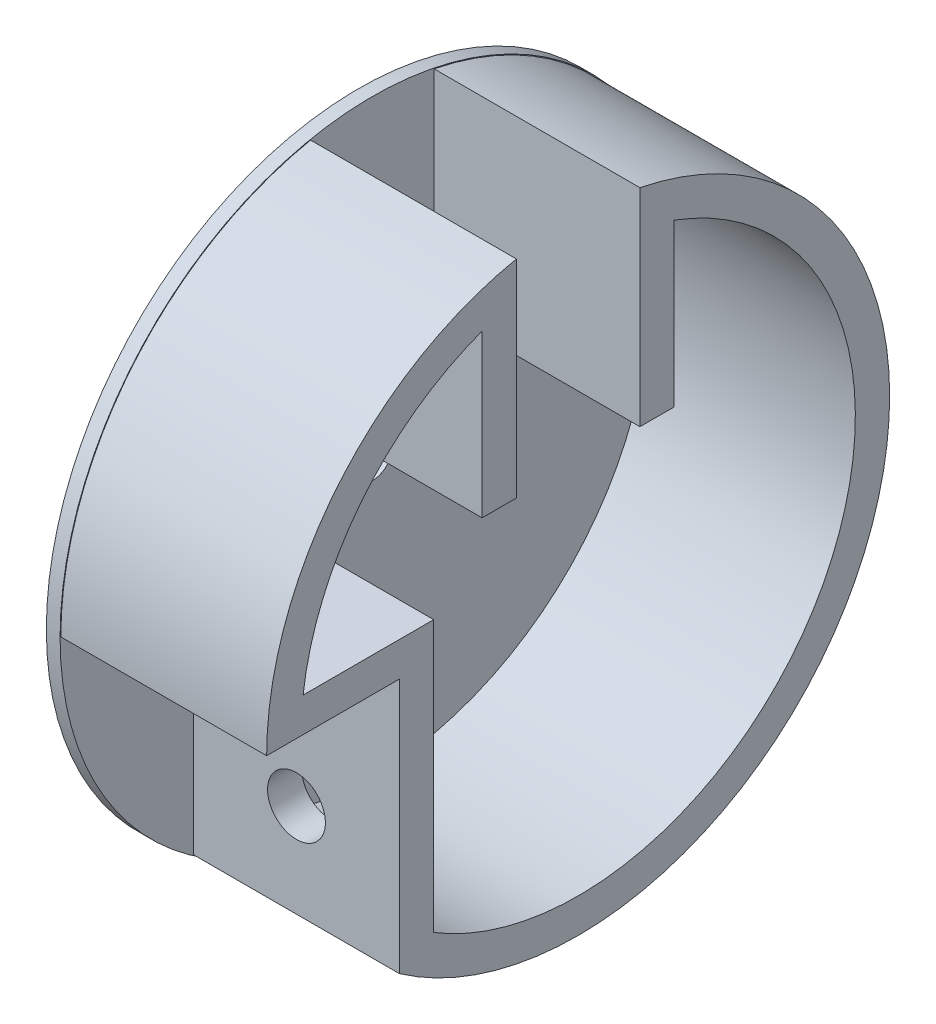
ISO-10303-21;
HEADER;
FILE_DESCRIPTION(('STEP AP214'),'2;1');
FILE_NAME('part.step','',(''),(''),'','','');
FILE_SCHEMA(('AUTOMOTIVE_DESIGN { 1 0 10303 214 1 1 1 1 }'));
ENDSEC;
DATA;
#1=APPLICATION_CONTEXT('core data for automotive mechanical design processes');
#2=APPLICATION_PROTOCOL_DEFINITION('international standard','automotive_design',2000,#1);
#3=PRODUCT_CONTEXT('',#1,'mechanical');
#4=PRODUCT('Part','Part','',(#3));
#5=PRODUCT_RELATED_PRODUCT_CATEGORY('part','',(#4));
#6=PRODUCT_DEFINITION_FORMATION('','',#4);
#7=PRODUCT_DEFINITION_CONTEXT('part definition',#1,'design');
#8=PRODUCT_DEFINITION('design','',#6,#7);
#9=PRODUCT_DEFINITION_SHAPE('','',#8);
#10=(LENGTH_UNIT() NAMED_UNIT(*) SI_UNIT(.MILLI.,.METRE.));
#11=(NAMED_UNIT(*) PLANE_ANGLE_UNIT() SI_UNIT($,.RADIAN.));
#12=(NAMED_UNIT(*) SI_UNIT($,.STERADIAN.) SOLID_ANGLE_UNIT());
#13=UNCERTAINTY_MEASURE_WITH_UNIT(LENGTH_MEASURE(1.E-05),#10,'distance_accuracy_value','');
#14=(GEOMETRIC_REPRESENTATION_CONTEXT(3) GLOBAL_UNCERTAINTY_ASSIGNED_CONTEXT((#13)) GLOBAL_UNIT_ASSIGNED_CONTEXT((#10,
#11,#12)) REPRESENTATION_CONTEXT('',''));
#15=CARTESIAN_POINT('',(0.,0.,0.));
#16=DIRECTION('',(0.,0.,1.));
#17=DIRECTION('',(1.,0.,0.));
#18=AXIS2_PLACEMENT_3D('',#15,#16,#17);
#19=CARTESIAN_POINT('',(30.,0.,0.));
#20=DIRECTION('',(1.,0.,0.));
#21=DIRECTION('',(0.,0.,-1.));
#22=AXIS2_PLACEMENT_3D('',#19,#20,#21);
#23=PLANE('',#22);
#24=DIRECTION('',(0.,-1.,0.));
#25=VECTOR('',#24,1.);
#26=CARTESIAN_POINT('',(30.,0.,-9.00000000000001));
#27=LINE('',#26,#25);
#28=CARTESIAN_POINT('',(30.,44.5006439960949,-8.99999999999999));
#29=VERTEX_POINT('',#28);
#30=CARTESIAN_POINT('',(30.,14.3257791915801,-9.));
#31=VERTEX_POINT('',#30);
#32=EDGE_CURVE('E127',#29,#31,#27,.T.);
#33=ORIENTED_EDGE('',*,*,#32,.T.);
#34=DIRECTION('',(0.,0.,-1.));
#35=VECTOR('',#34,1.);
#36=CARTESIAN_POINT('',(30.,14.3257791915801,0.));
#37=LINE('',#36,#35);
#38=CARTESIAN_POINT('',(30.,14.3257791915801,-14.));
#39=VERTEX_POINT('',#38);
#40=EDGE_CURVE('E11',#31,#39,#37,.T.);
#41=ORIENTED_EDGE('',*,*,#40,.T.);
#42=DIRECTION('',(0.,-1.,0.));
#43=VECTOR('',#42,1.);
#44=CARTESIAN_POINT('',(30.,0.,-14.));
#45=LINE('',#44,#43);
#46=CARTESIAN_POINT('',(30.,37.8984312620007,-14.));
#47=VERTEX_POINT('',#46);
#48=EDGE_CURVE('E465',#47,#39,#45,.T.);
#49=ORIENTED_EDGE('',*,*,#48,.F.);
#50=CARTESIAN_POINT('',(30.,0.,0.));
#51=DIRECTION('',(1.,0.,0.));
#52=DIRECTION('',(0.,0.,-1.));
#53=AXIS2_PLACEMENT_3D('',#50,#51,#52);
#54=CIRCLE('',#53,40.4016223946587);
#55=CARTESIAN_POINT('',(30.,-34.4821417654368,21.0540492872252));
#56=VERTEX_POINT('',#55);
#57=EDGE_CURVE('E467',#47,#56,#54,.F.);
#58=ORIENTED_EDGE('',*,*,#57,.T.);
#59=DIRECTION('',(0.,-1.,0.));
#60=VECTOR('',#59,1.);
#61=CARTESIAN_POINT('',(30.,0.,21.0540492872252));
#62=LINE('',#61,#60);
#63=CARTESIAN_POINT('',(30.,5.,21.0540492872252));
#64=VERTEX_POINT('',#63);
#65=EDGE_CURVE('E470',#64,#56,#62,.T.);
#66=ORIENTED_EDGE('',*,*,#65,.F.);
#67=DIRECTION('',(0.,0.,-1.));
#68=VECTOR('',#67,1.);
#69=CARTESIAN_POINT('',(30.,5.,0.));
#70=LINE('',#69,#68);
#71=CARTESIAN_POINT('',(30.,5.,40.0910350592322));
#72=VERTEX_POINT('',#71);
#73=EDGE_CURVE('E474',#72,#64,#70,.T.);
#74=ORIENTED_EDGE('',*,*,#73,.F.);
#75=CARTESIAN_POINT('',(30.,0.,0.));
#76=DIRECTION('',(1.,0.,0.));
#77=DIRECTION('',(0.,0.,-1.));
#78=AXIS2_PLACEMENT_3D('',#75,#76,#77);
#79=CIRCLE('',#78,40.4016223946587);
#80=CARTESIAN_POINT('',(30.,37.8984312620007,14.));
#81=VERTEX_POINT('',#80);
#82=EDGE_CURVE('E176',#72,#81,#79,.F.);
#83=ORIENTED_EDGE('',*,*,#82,.T.);
#84=DIRECTION('',(0.,-1.,0.));
#85=VECTOR('',#84,1.);
#86=CARTESIAN_POINT('',(30.,0.,14.));
#87=LINE('',#86,#85);
#88=CARTESIAN_POINT('',(30.,14.3257791915801,14.));
#89=VERTEX_POINT('',#88);
#90=EDGE_CURVE('E246',#81,#89,#87,.T.);
#91=ORIENTED_EDGE('',*,*,#90,.T.);
#92=CARTESIAN_POINT('',(30.,14.3257791915801,9.));
#93=VERTEX_POINT('',#92);
#94=EDGE_CURVE('E52',#89,#93,#37,.T.);
#95=ORIENTED_EDGE('',*,*,#94,.T.);
#96=DIRECTION('',(0.,-1.,0.));
#97=VECTOR('',#96,1.);
#98=CARTESIAN_POINT('',(30.,0.,9.));
#99=LINE('',#98,#97);
#100=CARTESIAN_POINT('',(30.,44.5006439960949,8.99999999999999));
#101=VERTEX_POINT('',#100);
#102=EDGE_CURVE('E129',#101,#93,#99,.T.);
#103=ORIENTED_EDGE('',*,*,#102,.F.);
#104=CARTESIAN_POINT('',(30.,0.,0.));
#105=DIRECTION('',(1.,0.,0.));
#106=DIRECTION('',(0.,0.,-1.));
#107=AXIS2_PLACEMENT_3D('',#104,#105,#106);
#108=CIRCLE('',#107,45.4016223946587);
#109=CARTESIAN_POINT('',(30.,0.,45.4016223946587));
#110=VERTEX_POINT('',#109);
#111=EDGE_CURVE('E149',#110,#101,#108,.F.);
#112=ORIENTED_EDGE('',*,*,#111,.F.);
#113=DIRECTION('',(0.,0.,-1.));
#114=VECTOR('',#113,1.);
#115=CARTESIAN_POINT('',(30.,0.,0.));
#116=LINE('',#115,#114);
#117=CARTESIAN_POINT('',(30.,0.,26.0540492872252));
#118=VERTEX_POINT('',#117);
#119=EDGE_CURVE('E109',#110,#118,#116,.T.);
#120=ORIENTED_EDGE('',*,*,#119,.T.);
#121=DIRECTION('',(0.,-1.,0.));
#122=VECTOR('',#121,1.);
#123=CARTESIAN_POINT('',(30.,0.,26.0540492872252));
#124=LINE('',#123,#122);
#125=CARTESIAN_POINT('',(30.,-37.1819019390619,26.0540492872252));
#126=VERTEX_POINT('',#125);
#127=EDGE_CURVE('E103',#118,#126,#124,.T.);
#128=ORIENTED_EDGE('',*,*,#127,.T.);
#129=CARTESIAN_POINT('',(30.,0.,0.));
#130=DIRECTION('',(1.,0.,0.));
#131=DIRECTION('',(0.,0.,-1.));
#132=AXIS2_PLACEMENT_3D('',#129,#130,#131);
#133=CIRCLE('',#132,45.4016223946587);
#134=EDGE_CURVE('E107',#29,#126,#133,.F.);
#135=ORIENTED_EDGE('',*,*,#134,.F.);
#136=EDGE_LOOP('',(#33,#41,#49,#58,#66,#74,#83,#91,#95,#103,#112,#120,#128,#135));
#137=FACE_BOUND('',#136,.T.);
#138=ADVANCED_FACE('F41',(#137),#23,.T.);
#139=CARTESIAN_POINT('',(30.,0.,0.));
#140=DIRECTION('',(-1.,0.,0.));
#141=DIRECTION('',(0.,0.,1.));
#142=AXIS2_PLACEMENT_3D('',#139,#140,#141);
#143=CYLINDRICAL_SURFACE('',#142,45.4016223946587);
#144=CARTESIAN_POINT('',(0.,0.,0.));
#145=DIRECTION('',(1.,0.,0.));
#146=DIRECTION('',(0.,0.,-1.));
#147=AXIS2_PLACEMENT_3D('',#144,#145,#146);
#148=CIRCLE('',#147,45.4016223946587);
#149=CARTESIAN_POINT('',(0.,0.,45.4016223946587));
#150=VERTEX_POINT('',#149);
#151=CARTESIAN_POINT('',(0.,44.5006439960949,8.99999999999999));
#152=VERTEX_POINT('',#151);
#153=EDGE_CURVE('E134',#150,#152,#148,.F.);
#154=ORIENTED_EDGE('',*,*,#153,.F.);
#155=DIRECTION('',(-1.,0.,0.));
#156=VECTOR('',#155,1.);
#157=CARTESIAN_POINT('',(30.,0.,45.4016223946587));
#158=LINE('',#157,#156);
#159=EDGE_CURVE('E45',#110,#150,#158,.T.);
#160=ORIENTED_EDGE('',*,*,#159,.F.);
#161=ORIENTED_EDGE('',*,*,#111,.T.);
#162=DIRECTION('',(-1.,0.,0.));
#163=VECTOR('',#162,1.);
#164=CARTESIAN_POINT('',(30.,44.5006439960949,8.99999999999999));
#165=LINE('',#164,#163);
#166=EDGE_CURVE('E68',#101,#152,#165,.T.);
#167=ORIENTED_EDGE('',*,*,#166,.T.);
#168=EDGE_LOOP('',(#154,#160,#161,#167));
#169=FACE_BOUND('',#168,.T.);
#170=ADVANCED_FACE('F43',(#169),#143,.T.);
#171=CARTESIAN_POINT('',(30.,0.,0.));
#172=DIRECTION('',(0.,1.,0.));
#173=DIRECTION('',(0.,0.,1.));
#174=AXIS2_PLACEMENT_3D('',#171,#172,#173);
#175=PLANE('',#174);
#176=DIRECTION('',(0.,0.,-1.));
#177=VECTOR('',#176,1.);
#178=CARTESIAN_POINT('',(0.,0.,0.));
#179=LINE('',#178,#177);
#180=CARTESIAN_POINT('',(0.,0.,26.0540492872252));
#181=VERTEX_POINT('',#180);
#182=EDGE_CURVE('E137',#150,#181,#179,.T.);
#183=ORIENTED_EDGE('',*,*,#182,.T.);
#184=DIRECTION('',(-1.,0.,0.));
#185=VECTOR('',#184,1.);
#186=CARTESIAN_POINT('',(30.,0.,26.0540492872252));
#187=LINE('',#186,#185);
#188=EDGE_CURVE('E122',#118,#181,#187,.T.);
#189=ORIENTED_EDGE('',*,*,#188,.F.);
#190=ORIENTED_EDGE('',*,*,#119,.F.);
#191=ORIENTED_EDGE('',*,*,#159,.T.);
#192=EDGE_LOOP('',(#183,#189,#190,#191));
#193=FACE_BOUND('',#192,.T.);
#194=ADVANCED_FACE('F260',(#193),#175,.F.);
#195=CARTESIAN_POINT('',(30.,0.,26.0540492872252));
#196=DIRECTION('',(0.,0.,-1.));
#197=DIRECTION('',(0.,1.,0.));
#198=AXIS2_PLACEMENT_3D('',#195,#196,#197);
#199=PLANE('',#198);
#200=CARTESIAN_POINT('',(15.,-23.5302877443781,26.0540492872252));
#201=DIRECTION('',(0.,0.,1.));
#202=DIRECTION('',(0.,-1.,0.));
#203=AXIS2_PLACEMENT_3D('',#200,#201,#202);
#204=CIRCLE('',#203,4.21639999999999);
#205=CARTESIAN_POINT('',(15.,-27.7466877443781,26.0540492872252));
#206=VERTEX_POINT('',#205);
#207=EDGE_CURVE('E448',#206,#206,#204,.T.);
#208=ORIENTED_EDGE('',*,*,#207,.F.);
#209=EDGE_LOOP('',(#208));
#210=FACE_BOUND('',#209,.T.);
#211=DIRECTION('',(0.,-1.,0.));
#212=VECTOR('',#211,1.);
#213=CARTESIAN_POINT('',(0.,0.,26.0540492872252));
#214=LINE('',#213,#212);
#215=CARTESIAN_POINT('',(0.,-37.1819019390619,26.0540492872252));
#216=VERTEX_POINT('',#215);
#217=EDGE_CURVE('E118',#181,#216,#214,.T.);
#218=ORIENTED_EDGE('',*,*,#217,.T.);
#219=DIRECTION('',(-1.,0.,0.));
#220=VECTOR('',#219,1.);
#221=CARTESIAN_POINT('',(30.,-37.1819019390619,26.0540492872252));
#222=LINE('',#221,#220);
#223=EDGE_CURVE('E115',#126,#216,#222,.T.);
#224=ORIENTED_EDGE('',*,*,#223,.F.);
#225=ORIENTED_EDGE('',*,*,#127,.F.);
#226=ORIENTED_EDGE('',*,*,#188,.T.);
#227=EDGE_LOOP('',(#218,#224,#225,#226));
#228=FACE_BOUND('',#227,.T.);
#229=ADVANCED_FACE('F116',(#210,#228),#199,.F.);
#230=CARTESIAN_POINT('',(30.,0.,0.));
#231=DIRECTION('',(-1.,0.,0.));
#232=DIRECTION('',(0.,0.,1.));
#233=AXIS2_PLACEMENT_3D('',#230,#231,#232);
#234=CYLINDRICAL_SURFACE('',#233,45.4016223946587);
#235=CARTESIAN_POINT('',(0.,0.,0.));
#236=DIRECTION('',(1.,0.,0.));
#237=DIRECTION('',(0.,0.,-1.));
#238=AXIS2_PLACEMENT_3D('',#235,#236,#237);
#239=CIRCLE('',#238,45.4016223946587);
#240=CARTESIAN_POINT('',(0.,44.5006439960949,-8.99999999999999));
#241=VERTEX_POINT('',#240);
#242=EDGE_CURVE('E141',#241,#216,#239,.F.);
#243=ORIENTED_EDGE('',*,*,#242,.F.);
#244=DIRECTION('',(-1.,0.,0.));
#245=VECTOR('',#244,1.);
#246=CARTESIAN_POINT('',(30.,44.5006439960949,-8.99999999999999));
#247=LINE('',#246,#245);
#248=EDGE_CURVE('E123',#29,#241,#247,.T.);
#249=ORIENTED_EDGE('',*,*,#248,.F.);
#250=ORIENTED_EDGE('',*,*,#134,.T.);
#251=ORIENTED_EDGE('',*,*,#223,.T.);
#252=EDGE_LOOP('',(#243,#249,#250,#251));
#253=FACE_BOUND('',#252,.T.);
#254=ADVANCED_FACE('F125',(#253),#234,.T.);
#255=CARTESIAN_POINT('',(30.,0.,-9.00000000000001));
#256=DIRECTION('',(0.,0.,-1.));
#257=DIRECTION('',(0.,1.,0.));
#258=AXIS2_PLACEMENT_3D('',#255,#256,#257);
#259=PLANE('',#258);
#260=DIRECTION('',(0.,-1.,0.));
#261=VECTOR('',#260,1.);
#262=CARTESIAN_POINT('',(0.,0.,-9.00000000000001));
#263=LINE('',#262,#261);
#264=CARTESIAN_POINT('',(0.,14.3257791915801,-9.));
#265=VERTEX_POINT('',#264);
#266=EDGE_CURVE('E143',#241,#265,#263,.T.);
#267=ORIENTED_EDGE('',*,*,#266,.T.);
#268=DIRECTION('',(-1.,0.,0.));
#269=VECTOR('',#268,1.);
#270=CARTESIAN_POINT('',(30.,14.3257791915801,-9.));
#271=LINE('',#270,#269);
#272=EDGE_CURVE('E154',#31,#265,#271,.T.);
#273=ORIENTED_EDGE('',*,*,#272,.F.);
#274=ORIENTED_EDGE('',*,*,#32,.F.);
#275=ORIENTED_EDGE('',*,*,#248,.T.);
#276=EDGE_LOOP('',(#267,#273,#274,#275));
#277=FACE_BOUND('',#276,.T.);
#278=ADVANCED_FACE('F278',(#277),#259,.F.);
#279=CARTESIAN_POINT('',(30.,0.,9.));
#280=DIRECTION('',(0.,0.,-1.));
#281=DIRECTION('',(0.,1.,0.));
#282=AXIS2_PLACEMENT_3D('',#279,#280,#281);
#283=PLANE('',#282);
#284=DIRECTION('',(0.,-1.,0.));
#285=VECTOR('',#284,1.);
#286=CARTESIAN_POINT('',(0.,0.,9.));
#287=LINE('',#286,#285);
#288=CARTESIAN_POINT('',(0.,14.3257791915801,8.99999999999999));
#289=VERTEX_POINT('',#288);
#290=EDGE_CURVE('E146',#152,#289,#287,.T.);
#291=ORIENTED_EDGE('',*,*,#290,.F.);
#292=ORIENTED_EDGE('',*,*,#166,.F.);
#293=ORIENTED_EDGE('',*,*,#102,.T.);
#294=DIRECTION('',(-1.,0.,0.));
#295=VECTOR('',#294,1.);
#296=CARTESIAN_POINT('',(30.,14.3257791915801,9.));
#297=LINE('',#296,#295);
#298=EDGE_CURVE('E151',#93,#289,#297,.T.);
#299=ORIENTED_EDGE('',*,*,#298,.T.);
#300=EDGE_LOOP('',(#291,#292,#293,#299));
#301=FACE_BOUND('',#300,.T.);
#302=ADVANCED_FACE('F200',(#301),#283,.T.);
#303=CARTESIAN_POINT('',(30.,14.3257791915801,0.));
#304=DIRECTION('',(0.,1.,0.));
#305=DIRECTION('',(0.,0.,1.));
#306=AXIS2_PLACEMENT_3D('',#303,#304,#305);
#307=PLANE('',#306);
#308=ORIENTED_EDGE('',*,*,#94,.F.);
#309=DIRECTION('',(-1.,0.,0.));
#310=VECTOR('',#309,1.);
#311=CARTESIAN_POINT('',(30.,14.3257791915801,14.));
#312=LINE('',#311,#310);
#313=CARTESIAN_POINT('',(0.,14.3257791915801,14.));
#314=VERTEX_POINT('',#313);
#315=EDGE_CURVE('E250',#89,#314,#312,.T.);
#316=ORIENTED_EDGE('',*,*,#315,.T.);
#317=DIRECTION('',(0.,0.,-1.));
#318=VECTOR('',#317,1.);
#319=CARTESIAN_POINT('',(0.,14.3257791915801,0.));
#320=LINE('',#319,#318);
#321=EDGE_CURVE('E160',#314,#289,#320,.T.);
#322=ORIENTED_EDGE('',*,*,#321,.T.);
#323=ORIENTED_EDGE('',*,*,#298,.F.);
#324=EDGE_LOOP('',(#308,#316,#322,#323));
#325=FACE_BOUND('',#324,.T.);
#326=ADVANCED_FACE('F277',(#325),#307,.F.);
#327=CARTESIAN_POINT('',(30.,0.,0.));
#328=DIRECTION('',(-1.,0.,0.));
#329=DIRECTION('',(0.,0.,1.));
#330=AXIS2_PLACEMENT_3D('',#327,#328,#329);
#331=CYLINDRICAL_SURFACE('',#330,40.4016223946587);
#332=CARTESIAN_POINT('',(0.,0.,0.));
#333=DIRECTION('',(1.,0.,0.));
#334=DIRECTION('',(0.,0.,-1.));
#335=AXIS2_PLACEMENT_3D('',#332,#333,#334);
#336=CIRCLE('',#335,40.4016223946587);
#337=CARTESIAN_POINT('',(0.,5.,40.0910350592322));
#338=VERTEX_POINT('',#337);
#339=CARTESIAN_POINT('',(0.,37.8984312620007,14.));
#340=VERTEX_POINT('',#339);
#341=EDGE_CURVE('E194',#338,#340,#336,.F.);
#342=ORIENTED_EDGE('',*,*,#341,.T.);
#343=DIRECTION('',(-1.,0.,0.));
#344=VECTOR('',#343,1.);
#345=CARTESIAN_POINT('',(30.,37.8984312620007,14.));
#346=LINE('',#345,#344);
#347=EDGE_CURVE('E242',#81,#340,#346,.T.);
#348=ORIENTED_EDGE('',*,*,#347,.F.);
#349=ORIENTED_EDGE('',*,*,#82,.F.);
#350=DIRECTION('',(-1.,0.,0.));
#351=VECTOR('',#350,1.);
#352=CARTESIAN_POINT('',(30.,5.,40.0910350592322));
#353=LINE('',#352,#351);
#354=EDGE_CURVE('E138',#72,#338,#353,.T.);
#355=ORIENTED_EDGE('',*,*,#354,.T.);
#356=EDGE_LOOP('',(#342,#348,#349,#355));
#357=FACE_BOUND('',#356,.T.);
#358=ADVANCED_FACE('F253',(#357),#331,.F.);
#359=CARTESIAN_POINT('',(30.,5.,0.));
#360=DIRECTION('',(0.,1.,0.));
#361=DIRECTION('',(0.,0.,1.));
#362=AXIS2_PLACEMENT_3D('',#359,#360,#361);
#363=PLANE('',#362);
#364=DIRECTION('',(0.,0.,-1.));
#365=VECTOR('',#364,1.);
#366=CARTESIAN_POINT('',(0.,5.,0.));
#367=LINE('',#366,#365);
#368=CARTESIAN_POINT('',(0.,5.,21.0540492872252));
#369=VERTEX_POINT('',#368);
#370=EDGE_CURVE('E191',#338,#369,#367,.T.);
#371=ORIENTED_EDGE('',*,*,#370,.F.);
#372=ORIENTED_EDGE('',*,*,#354,.F.);
#373=ORIENTED_EDGE('',*,*,#73,.T.);
#374=DIRECTION('',(-1.,0.,0.));
#375=VECTOR('',#374,1.);
#376=CARTESIAN_POINT('',(30.,5.,21.0540492872252));
#377=LINE('',#376,#375);
#378=EDGE_CURVE('E482',#64,#369,#377,.T.);
#379=ORIENTED_EDGE('',*,*,#378,.T.);
#380=EDGE_LOOP('',(#371,#372,#373,#379));
#381=FACE_BOUND('',#380,.T.);
#382=ADVANCED_FACE('F308',(#381),#363,.T.);
#383=CARTESIAN_POINT('',(30.,0.,21.0540492872252));
#384=DIRECTION('',(0.,0.,-1.));
#385=DIRECTION('',(0.,1.,0.));
#386=AXIS2_PLACEMENT_3D('',#383,#384,#385);
#387=PLANE('',#386);
#388=CARTESIAN_POINT('',(15.,-23.5302877443781,21.0540492872252));
#389=DIRECTION('',(0.,0.,-1.));
#390=DIRECTION('',(0.,1.,0.));
#391=AXIS2_PLACEMENT_3D('',#388,#389,#390);
#392=CIRCLE('',#391,4.21639999999999);
#393=CARTESIAN_POINT('',(15.,-19.3138877443781,21.0540492872252));
#394=VERTEX_POINT('',#393);
#395=EDGE_CURVE('E451',#394,#394,#392,.T.);
#396=ORIENTED_EDGE('',*,*,#395,.F.);
#397=EDGE_LOOP('',(#396));
#398=FACE_BOUND('',#397,.T.);
#399=DIRECTION('',(0.,-1.,0.));
#400=VECTOR('',#399,1.);
#401=CARTESIAN_POINT('',(0.,0.,21.0540492872252));
#402=LINE('',#401,#400);
#403=CARTESIAN_POINT('',(0.,-34.4821417654368,21.0540492872252));
#404=VERTEX_POINT('',#403);
#405=EDGE_CURVE('E59',#369,#404,#402,.T.);
#406=ORIENTED_EDGE('',*,*,#405,.F.);
#407=ORIENTED_EDGE('',*,*,#378,.F.);
#408=ORIENTED_EDGE('',*,*,#65,.T.);
#409=DIRECTION('',(-1.,0.,0.));
#410=VECTOR('',#409,1.);
#411=CARTESIAN_POINT('',(30.,-34.4821417654368,21.0540492872252));
#412=LINE('',#411,#410);
#413=EDGE_CURVE('E480',#56,#404,#412,.T.);
#414=ORIENTED_EDGE('',*,*,#413,.T.);
#415=EDGE_LOOP('',(#406,#407,#408,#414));
#416=FACE_BOUND('',#415,.T.);
#417=ADVANCED_FACE('F315',(#398,#416),#387,.T.);
#418=CARTESIAN_POINT('',(30.,0.,0.));
#419=DIRECTION('',(-1.,0.,0.));
#420=DIRECTION('',(0.,0.,1.));
#421=AXIS2_PLACEMENT_3D('',#418,#419,#420);
#422=CYLINDRICAL_SURFACE('',#421,40.4016223946587);
#423=CARTESIAN_POINT('',(0.,0.,0.));
#424=DIRECTION('',(1.,0.,0.));
#425=DIRECTION('',(0.,0.,-1.));
#426=AXIS2_PLACEMENT_3D('',#423,#424,#425);
#427=CIRCLE('',#426,40.4016223946587);
#428=CARTESIAN_POINT('',(0.,37.8984312620007,-14.));
#429=VERTEX_POINT('',#428);
#430=EDGE_CURVE('E179',#429,#404,#427,.F.);
#431=ORIENTED_EDGE('',*,*,#430,.T.);
#432=ORIENTED_EDGE('',*,*,#413,.F.);
#433=ORIENTED_EDGE('',*,*,#57,.F.);
#434=DIRECTION('',(-1.,0.,0.));
#435=VECTOR('',#434,1.);
#436=CARTESIAN_POINT('',(30.,37.8984312620007,-14.));
#437=LINE('',#436,#435);
#438=EDGE_CURVE('E478',#47,#429,#437,.T.);
#439=ORIENTED_EDGE('',*,*,#438,.T.);
#440=EDGE_LOOP('',(#431,#432,#433,#439));
#441=FACE_BOUND('',#440,.T.);
#442=ADVANCED_FACE('F324',(#441),#422,.F.);
#443=CARTESIAN_POINT('',(30.,0.,-14.));
#444=DIRECTION('',(0.,0.,-1.));
#445=DIRECTION('',(0.,1.,0.));
#446=AXIS2_PLACEMENT_3D('',#443,#444,#445);
#447=PLANE('',#446);
#448=DIRECTION('',(0.,-1.,0.));
#449=VECTOR('',#448,1.);
#450=CARTESIAN_POINT('',(0.,0.,-14.));
#451=LINE('',#450,#449);
#452=CARTESIAN_POINT('',(0.,14.3257791915801,-14.));
#453=VERTEX_POINT('',#452);
#454=EDGE_CURVE('E169',#429,#453,#451,.T.);
#455=ORIENTED_EDGE('',*,*,#454,.F.);
#456=ORIENTED_EDGE('',*,*,#438,.F.);
#457=ORIENTED_EDGE('',*,*,#48,.T.);
#458=DIRECTION('',(-1.,0.,0.));
#459=VECTOR('',#458,1.);
#460=CARTESIAN_POINT('',(30.,14.3257791915801,-14.));
#461=LINE('',#460,#459);
#462=EDGE_CURVE('E187',#39,#453,#461,.T.);
#463=ORIENTED_EDGE('',*,*,#462,.T.);
#464=EDGE_LOOP('',(#455,#456,#457,#463));
#465=FACE_BOUND('',#464,.T.);
#466=ADVANCED_FACE('F332',(#465),#447,.T.);
#467=ORIENTED_EDGE('',*,*,#272,.T.);
#468=EDGE_CURVE('E50',#265,#453,#320,.T.);
#469=ORIENTED_EDGE('',*,*,#468,.T.);
#470=ORIENTED_EDGE('',*,*,#462,.F.);
#471=ORIENTED_EDGE('',*,*,#40,.F.);
#472=EDGE_LOOP('',(#467,#469,#470,#471));
#473=FACE_BOUND('',#472,.T.);
#474=ADVANCED_FACE('F302',(#473),#307,.F.);
#475=CARTESIAN_POINT('',(30.,0.,14.));
#476=DIRECTION('',(0.,0.,-1.));
#477=DIRECTION('',(0.,1.,0.));
#478=AXIS2_PLACEMENT_3D('',#475,#476,#477);
#479=PLANE('',#478);
#480=DIRECTION('',(0.,-1.,0.));
#481=VECTOR('',#480,1.);
#482=CARTESIAN_POINT('',(0.,0.,14.));
#483=LINE('',#482,#481);
#484=EDGE_CURVE('E168',#340,#314,#483,.T.);
#485=ORIENTED_EDGE('',*,*,#484,.T.);
#486=ORIENTED_EDGE('',*,*,#315,.F.);
#487=ORIENTED_EDGE('',*,*,#90,.F.);
#488=ORIENTED_EDGE('',*,*,#347,.T.);
#489=EDGE_LOOP('',(#485,#486,#487,#488));
#490=FACE_BOUND('',#489,.T.);
#491=ADVANCED_FACE('F244',(#490),#479,.F.);
#492=CARTESIAN_POINT('',(-1.99999999999999,0.,0.));
#493=DIRECTION('',(-1.,0.,0.));
#494=DIRECTION('',(0.,0.,1.));
#495=AXIS2_PLACEMENT_3D('',#492,#493,#494);
#496=PLANE('',#495);
#497=CARTESIAN_POINT('',(-1.99999999999999,0.,0.));
#498=DIRECTION('',(-1.,0.,0.));
#499=DIRECTION('',(0.,0.,1.));
#500=AXIS2_PLACEMENT_3D('',#497,#498,#499);
#501=CIRCLE('',#500,45.5105578648431);
#502=CARTESIAN_POINT('',(-1.99999999999999,0.,45.5105578648431));
#503=VERTEX_POINT('',#502);
#504=EDGE_CURVE('E255',#503,#503,#501,.T.);
#505=ORIENTED_EDGE('',*,*,#504,.T.);
#506=EDGE_LOOP('',(#505));
#507=FACE_BOUND('',#506,.T.);
#508=CARTESIAN_POINT('',(-1.99999999999999,0.,0.));
#509=DIRECTION('',(-1.,0.,0.));
#510=DIRECTION('',(0.,0.,1.));
#511=AXIS2_PLACEMENT_3D('',#508,#509,#510);
#512=CIRCLE('',#511,3.);
#513=CARTESIAN_POINT('',(-1.99999999999999,0.,3.));
#514=VERTEX_POINT('',#513);
#515=EDGE_CURVE('E455',#514,#514,#512,.T.);
#516=ORIENTED_EDGE('',*,*,#515,.F.);
#517=EDGE_LOOP('',(#516));
#518=FACE_BOUND('',#517,.T.);
#519=ADVANCED_FACE('F351',(#507,#518),#496,.T.);
#520=CARTESIAN_POINT('',(0.,0.,0.));
#521=DIRECTION('',(-1.,0.,0.));
#522=DIRECTION('',(0.,0.,1.));
#523=AXIS2_PLACEMENT_3D('',#520,#521,#522);
#524=PLANE('',#523);
#525=ORIENTED_EDGE('',*,*,#321,.F.);
#526=ORIENTED_EDGE('',*,*,#484,.F.);
#527=ORIENTED_EDGE('',*,*,#341,.F.);
#528=ORIENTED_EDGE('',*,*,#370,.T.);
#529=ORIENTED_EDGE('',*,*,#405,.T.);
#530=ORIENTED_EDGE('',*,*,#430,.F.);
#531=ORIENTED_EDGE('',*,*,#454,.T.);
#532=ORIENTED_EDGE('',*,*,#468,.F.);
#533=ORIENTED_EDGE('',*,*,#266,.F.);
#534=ORIENTED_EDGE('',*,*,#242,.T.);
#535=ORIENTED_EDGE('',*,*,#217,.F.);
#536=ORIENTED_EDGE('',*,*,#182,.F.);
#537=ORIENTED_EDGE('',*,*,#153,.T.);
#538=ORIENTED_EDGE('',*,*,#290,.T.);
#539=EDGE_LOOP('',(#525,#526,#527,#528,#529,#530,#531,#532,#533,#534,#535,#536,#537,#538));
#540=FACE_BOUND('',#539,.T.);
#541=CARTESIAN_POINT('',(0.,0.,0.));
#542=DIRECTION('',(-1.,0.,0.));
#543=DIRECTION('',(0.,0.,1.));
#544=AXIS2_PLACEMENT_3D('',#541,#542,#543);
#545=CIRCLE('',#544,45.5105578648431);
#546=CARTESIAN_POINT('',(0.,0.,45.5105578648431));
#547=VERTEX_POINT('',#546);
#548=EDGE_CURVE('E460',#547,#547,#545,.T.);
#549=ORIENTED_EDGE('',*,*,#548,.F.);
#550=EDGE_LOOP('',(#549));
#551=FACE_BOUND('',#550,.T.);
#552=CARTESIAN_POINT('',(0.,0.,0.));
#553=DIRECTION('',(-1.,0.,0.));
#554=DIRECTION('',(0.,0.,1.));
#555=AXIS2_PLACEMENT_3D('',#552,#553,#554);
#556=CIRCLE('',#555,3.);
#557=CARTESIAN_POINT('',(0.,0.,3.));
#558=VERTEX_POINT('',#557);
#559=EDGE_CURVE('E452',#558,#558,#556,.T.);
#560=ORIENTED_EDGE('',*,*,#559,.T.);
#561=EDGE_LOOP('',(#560));
#562=FACE_BOUND('',#561,.T.);
#563=ADVANCED_FACE('F257',(#540,#551,#562),#524,.F.);
#564=CARTESIAN_POINT('',(-1.99999999999999,0.,0.));
#565=DIRECTION('',(1.,0.,0.));
#566=DIRECTION('',(0.,0.,-1.));
#567=AXIS2_PLACEMENT_3D('',#564,#565,#566);
#568=CYLINDRICAL_SURFACE('',#567,45.5105578648431);
#569=ORIENTED_EDGE('',*,*,#504,.F.);
#570=EDGE_LOOP('',(#569));
#571=FACE_BOUND('',#570,.T.);
#572=ORIENTED_EDGE('',*,*,#548,.T.);
#573=EDGE_LOOP('',(#572));
#574=FACE_BOUND('',#573,.T.);
#575=ADVANCED_FACE('F364',(#571,#574),#568,.T.);
#576=CARTESIAN_POINT('',(-1.99999999999999,0.,0.));
#577=DIRECTION('',(1.,0.,0.));
#578=DIRECTION('',(0.,0.,-1.));
#579=AXIS2_PLACEMENT_3D('',#576,#577,#578);
#580=CYLINDRICAL_SURFACE('',#579,3.);
#581=ORIENTED_EDGE('',*,*,#515,.T.);
#582=EDGE_LOOP('',(#581));
#583=FACE_BOUND('',#582,.T.);
#584=ORIENTED_EDGE('',*,*,#559,.F.);
#585=EDGE_LOOP('',(#584));
#586=FACE_BOUND('',#585,.T.);
#587=ADVANCED_FACE('F371',(#583,#586),#580,.F.);
#588=CARTESIAN_POINT('',(15.,-23.5302877443781,26.0540492872252));
#589=DIRECTION('',(0.,0.,1.));
#590=DIRECTION('',(0.,-1.,0.));
#591=AXIS2_PLACEMENT_3D('',#588,#589,#590);
#592=CYLINDRICAL_SURFACE('',#591,4.21639999999999);
#593=ORIENTED_EDGE('',*,*,#207,.T.);
#594=EDGE_LOOP('',(#593));
#595=FACE_BOUND('',#594,.T.);
#596=ORIENTED_EDGE('',*,*,#395,.T.);
#597=EDGE_LOOP('',(#596));
#598=FACE_BOUND('',#597,.T.);
#599=ADVANCED_FACE('F379',(#595,#598),#592,.F.);
#600=CLOSED_SHELL('',(#138,#170,#194,#229,#254,#278,#302,#326,#358,#382,#417,#442,#466,#474,
#491,#519,#563,#575,#587,#599));
#601=MANIFOLD_SOLID_BREP('B2',#600);
#602=ADVANCED_BREP_SHAPE_REPRESENTATION('',(#18,#601),#14);
#603=SHAPE_DEFINITION_REPRESENTATION(#9,#602);
ENDSEC;
END-ISO-10303-21;
